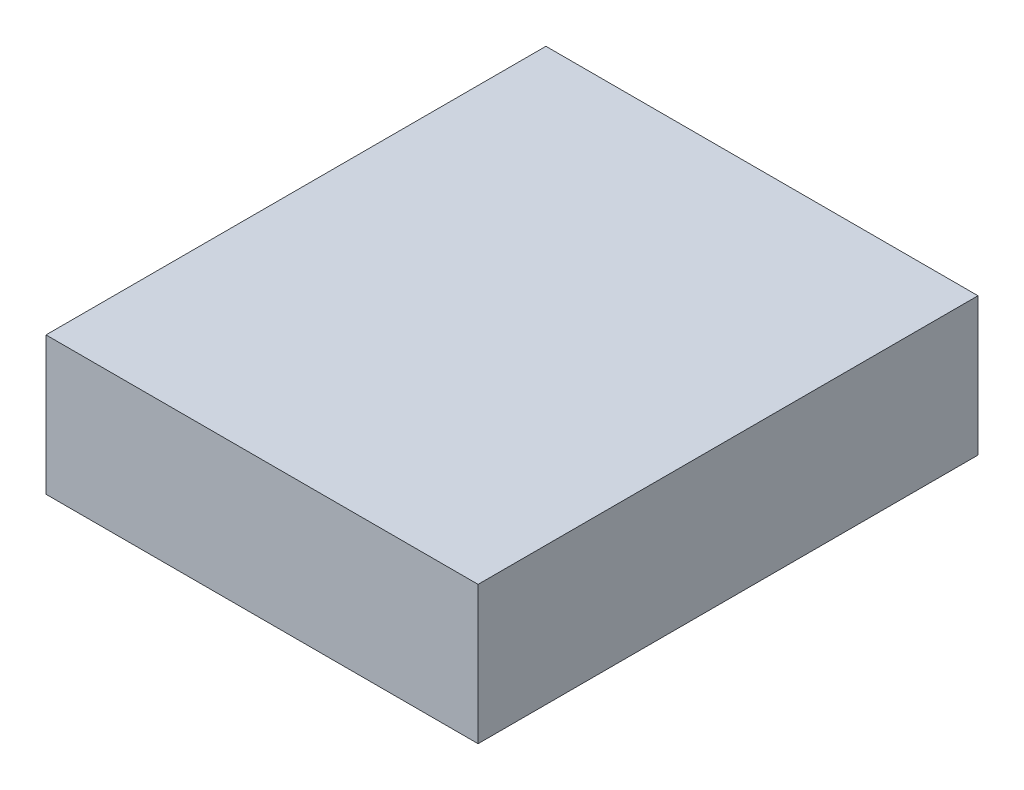
ISO-10303-21;
HEADER;
FILE_DESCRIPTION(('STEP AP214'),'2;1');
FILE_NAME('part.step','',(''),(''),'','','');
FILE_SCHEMA(('AUTOMOTIVE_DESIGN { 1 0 10303 214 1 1 1 1 }'));
ENDSEC;
DATA;
#1=APPLICATION_CONTEXT('core data for automotive mechanical design processes');
#2=APPLICATION_PROTOCOL_DEFINITION('international standard','automotive_design',2000,#1);
#3=PRODUCT_CONTEXT('',#1,'mechanical');
#4=PRODUCT('Part','Part','',(#3));
#5=PRODUCT_RELATED_PRODUCT_CATEGORY('part','',(#4));
#6=PRODUCT_DEFINITION_FORMATION('','',#4);
#7=PRODUCT_DEFINITION_CONTEXT('part definition',#1,'design');
#8=PRODUCT_DEFINITION('design','',#6,#7);
#9=PRODUCT_DEFINITION_SHAPE('','',#8);
#10=(LENGTH_UNIT() NAMED_UNIT(*) SI_UNIT(.MILLI.,.METRE.));
#11=(NAMED_UNIT(*) PLANE_ANGLE_UNIT() SI_UNIT($,.RADIAN.));
#12=(NAMED_UNIT(*) SI_UNIT($,.STERADIAN.) SOLID_ANGLE_UNIT());
#13=UNCERTAINTY_MEASURE_WITH_UNIT(LENGTH_MEASURE(1.E-05),#10,'distance_accuracy_value','');
#14=(GEOMETRIC_REPRESENTATION_CONTEXT(3) GLOBAL_UNCERTAINTY_ASSIGNED_CONTEXT((#13)) GLOBAL_UNIT_ASSIGNED_CONTEXT((#10,
#11,#12)) REPRESENTATION_CONTEXT('',''));
#15=CARTESIAN_POINT('',(0.,0.,0.));
#16=DIRECTION('',(0.,0.,1.));
#17=DIRECTION('',(1.,0.,0.));
#18=AXIS2_PLACEMENT_3D('',#15,#16,#17);
#19=CARTESIAN_POINT('',(15.6523601901205,10.,18.1101688150155));
#20=DIRECTION('',(-1.,0.,0.));
#21=DIRECTION('',(0.,0.,1.));
#22=AXIS2_PLACEMENT_3D('',#19,#20,#21);
#23=PLANE('',#22);
#24=DIRECTION('',(0.,0.,-1.));
#25=VECTOR('',#24,1.);
#26=CARTESIAN_POINT('',(15.6523601901205,0.,18.1101688150155));
#27=LINE('',#26,#25);
#28=CARTESIAN_POINT('',(15.6523601901205,0.,18.1101688150155));
#29=VERTEX_POINT('',#28);
#30=CARTESIAN_POINT('',(15.6523601901205,0.,-18.1101688150155));
#31=VERTEX_POINT('',#30);
#32=EDGE_CURVE('E96',#29,#31,#27,.T.);
#33=ORIENTED_EDGE('',*,*,#32,.T.);
#34=DIRECTION('',(0.,-1.,0.));
#35=VECTOR('',#34,1.);
#36=CARTESIAN_POINT('',(15.6523601901205,10.,-18.1101688150155));
#37=LINE('',#36,#35);
#38=CARTESIAN_POINT('',(15.6523601901205,10.,-18.1101688150155));
#39=VERTEX_POINT('',#38);
#40=EDGE_CURVE('E11',#39,#31,#37,.T.);
#41=ORIENTED_EDGE('',*,*,#40,.F.);
#42=DIRECTION('',(0.,0.,-1.));
#43=VECTOR('',#42,1.);
#44=CARTESIAN_POINT('',(15.6523601901205,10.,18.1101688150155));
#45=LINE('',#44,#43);
#46=CARTESIAN_POINT('',(15.6523601901205,10.,18.1101688150155));
#47=VERTEX_POINT('',#46);
#48=EDGE_CURVE('E84',#47,#39,#45,.T.);
#49=ORIENTED_EDGE('',*,*,#48,.F.);
#50=DIRECTION('',(0.,-1.,0.));
#51=VECTOR('',#50,1.);
#52=CARTESIAN_POINT('',(15.6523601901205,10.,18.1101688150155));
#53=LINE('',#52,#51);
#54=EDGE_CURVE('E92',#47,#29,#53,.T.);
#55=ORIENTED_EDGE('',*,*,#54,.T.);
#56=EDGE_LOOP('',(#33,#41,#49,#55));
#57=FACE_BOUND('',#56,.T.);
#58=ADVANCED_FACE('F33',(#57),#23,.F.);
#59=CARTESIAN_POINT('',(-15.6523601901205,10.,-18.1101688150155));
#60=DIRECTION('',(0.,0.,1.));
#61=DIRECTION('',(1.,0.,0.));
#62=AXIS2_PLACEMENT_3D('',#59,#60,#61);
#63=PLANE('',#62);
#64=DIRECTION('',(-1.,0.,0.));
#65=VECTOR('',#64,1.);
#66=CARTESIAN_POINT('',(-15.6523601901205,0.,-18.1101688150155));
#67=LINE('',#66,#65);
#68=CARTESIAN_POINT('',(-15.6523601901205,0.,-18.1101688150155));
#69=VERTEX_POINT('',#68);
#70=EDGE_CURVE('E88',#31,#69,#67,.T.);
#71=ORIENTED_EDGE('',*,*,#70,.T.);
#72=DIRECTION('',(0.,-1.,0.));
#73=VECTOR('',#72,1.);
#74=CARTESIAN_POINT('',(-15.6523601901205,10.,-18.1101688150155));
#75=LINE('',#74,#73);
#76=CARTESIAN_POINT('',(-15.6523601901205,10.,-18.1101688150155));
#77=VERTEX_POINT('',#76);
#78=EDGE_CURVE('E41',#77,#69,#75,.T.);
#79=ORIENTED_EDGE('',*,*,#78,.F.);
#80=DIRECTION('',(-1.,0.,0.));
#81=VECTOR('',#80,1.);
#82=CARTESIAN_POINT('',(-15.6523601901205,10.,-18.1101688150155));
#83=LINE('',#82,#81);
#84=EDGE_CURVE('E79',#39,#77,#83,.T.);
#85=ORIENTED_EDGE('',*,*,#84,.F.);
#86=ORIENTED_EDGE('',*,*,#40,.T.);
#87=EDGE_LOOP('',(#71,#79,#85,#86));
#88=FACE_BOUND('',#87,.T.);
#89=ADVANCED_FACE('F87',(#88),#63,.F.);
#90=CARTESIAN_POINT('',(-15.6523601901205,10.,18.1101688150155));
#91=DIRECTION('',(1.,0.,0.));
#92=DIRECTION('',(0.,0.,-1.));
#93=AXIS2_PLACEMENT_3D('',#90,#91,#92);
#94=PLANE('',#93);
#95=DIRECTION('',(0.,0.,1.));
#96=VECTOR('',#95,1.);
#97=CARTESIAN_POINT('',(-15.6523601901205,0.,18.1101688150155));
#98=LINE('',#97,#96);
#99=CARTESIAN_POINT('',(-15.6523601901205,0.,18.1101688150155));
#100=VERTEX_POINT('',#99);
#101=EDGE_CURVE('E66',#69,#100,#98,.T.);
#102=ORIENTED_EDGE('',*,*,#101,.T.);
#103=DIRECTION('',(0.,-1.,0.));
#104=VECTOR('',#103,1.);
#105=CARTESIAN_POINT('',(-15.6523601901205,10.,18.1101688150155));
#106=LINE('',#105,#104);
#107=CARTESIAN_POINT('',(-15.6523601901205,10.,18.1101688150155));
#108=VERTEX_POINT('',#107);
#109=EDGE_CURVE('E89',#108,#100,#106,.T.);
#110=ORIENTED_EDGE('',*,*,#109,.F.);
#111=DIRECTION('',(0.,0.,1.));
#112=VECTOR('',#111,1.);
#113=CARTESIAN_POINT('',(-15.6523601901205,10.,18.1101688150155));
#114=LINE('',#113,#112);
#115=EDGE_CURVE('E82',#77,#108,#114,.T.);
#116=ORIENTED_EDGE('',*,*,#115,.F.);
#117=ORIENTED_EDGE('',*,*,#78,.T.);
#118=EDGE_LOOP('',(#102,#110,#116,#117));
#119=FACE_BOUND('',#118,.T.);
#120=ADVANCED_FACE('F90',(#119),#94,.F.);
#121=CARTESIAN_POINT('',(-15.6523601901205,10.,18.1101688150155));
#122=DIRECTION('',(0.,0.,-1.));
#123=DIRECTION('',(-1.,0.,0.));
#124=AXIS2_PLACEMENT_3D('',#121,#122,#123);
#125=PLANE('',#124);
#126=DIRECTION('',(1.,0.,0.));
#127=VECTOR('',#126,1.);
#128=CARTESIAN_POINT('',(-15.6523601901205,0.,18.1101688150155));
#129=LINE('',#128,#127);
#130=EDGE_CURVE('E72',#100,#29,#129,.T.);
#131=ORIENTED_EDGE('',*,*,#130,.T.);
#132=ORIENTED_EDGE('',*,*,#54,.F.);
#133=DIRECTION('',(1.,0.,0.));
#134=VECTOR('',#133,1.);
#135=CARTESIAN_POINT('',(-15.6523601901205,10.,18.1101688150155));
#136=LINE('',#135,#134);
#137=EDGE_CURVE('E49',#108,#47,#136,.T.);
#138=ORIENTED_EDGE('',*,*,#137,.F.);
#139=ORIENTED_EDGE('',*,*,#109,.T.);
#140=EDGE_LOOP('',(#131,#132,#138,#139));
#141=FACE_BOUND('',#140,.T.);
#142=ADVANCED_FACE('F103',(#141),#125,.F.);
#143=CARTESIAN_POINT('',(0.,10.,0.));
#144=DIRECTION('',(0.,-1.,0.));
#145=DIRECTION('',(0.,0.,-1.));
#146=AXIS2_PLACEMENT_3D('',#143,#144,#145);
#147=PLANE('',#146);
#148=ORIENTED_EDGE('',*,*,#48,.T.);
#149=ORIENTED_EDGE('',*,*,#84,.T.);
#150=ORIENTED_EDGE('',*,*,#115,.T.);
#151=ORIENTED_EDGE('',*,*,#137,.T.);
#152=EDGE_LOOP('',(#148,#149,#150,#151));
#153=FACE_BOUND('',#152,.T.);
#154=ADVANCED_FACE('F80',(#153),#147,.F.);
#155=CARTESIAN_POINT('',(0.,0.,0.));
#156=DIRECTION('',(0.,-1.,0.));
#157=DIRECTION('',(0.,0.,-1.));
#158=AXIS2_PLACEMENT_3D('',#155,#156,#157);
#159=PLANE('',#158);
#160=ORIENTED_EDGE('',*,*,#32,.F.);
#161=ORIENTED_EDGE('',*,*,#130,.F.);
#162=ORIENTED_EDGE('',*,*,#101,.F.);
#163=ORIENTED_EDGE('',*,*,#70,.F.);
#164=EDGE_LOOP('',(#160,#161,#162,#163));
#165=FACE_BOUND('',#164,.T.);
#166=ADVANCED_FACE('F106',(#165),#159,.T.);
#167=CLOSED_SHELL('',(#58,#89,#120,#142,#154,#166));
#168=MANIFOLD_SOLID_BREP('B2',#167);
#169=ADVANCED_BREP_SHAPE_REPRESENTATION('',(#18,#168),#14);
#170=SHAPE_DEFINITION_REPRESENTATION(#9,#169);
ENDSEC;
END-ISO-10303-21;
